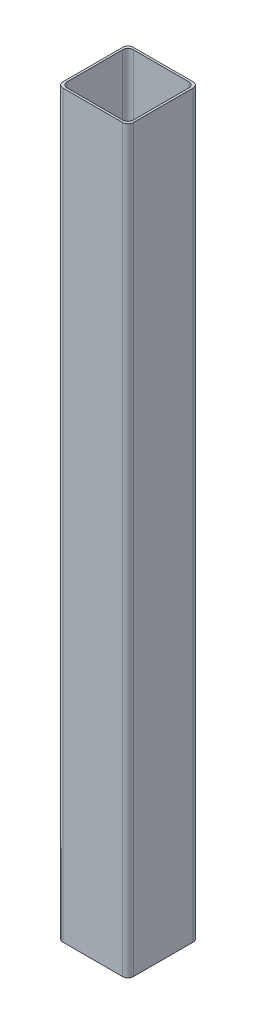
ISO-10303-21;
HEADER;
FILE_DESCRIPTION(('STEP AP214'),'2;1');
FILE_NAME('part.step','',(''),(''),'','','');
FILE_SCHEMA(('AUTOMOTIVE_DESIGN { 1 0 10303 214 1 1 1 1 }'));
ENDSEC;
DATA;
#1=APPLICATION_CONTEXT('core data for automotive mechanical design processes');
#2=APPLICATION_PROTOCOL_DEFINITION('international standard','automotive_design',2000,#1);
#3=PRODUCT_CONTEXT('',#1,'mechanical');
#4=PRODUCT('Part','Part','',(#3));
#5=PRODUCT_RELATED_PRODUCT_CATEGORY('part','',(#4));
#6=PRODUCT_DEFINITION_FORMATION('','',#4);
#7=PRODUCT_DEFINITION_CONTEXT('part definition',#1,'design');
#8=PRODUCT_DEFINITION('design','',#6,#7);
#9=PRODUCT_DEFINITION_SHAPE('','',#8);
#10=(LENGTH_UNIT() NAMED_UNIT(*) SI_UNIT(.MILLI.,.METRE.));
#11=(NAMED_UNIT(*) PLANE_ANGLE_UNIT() SI_UNIT($,.RADIAN.));
#12=(NAMED_UNIT(*) SI_UNIT($,.STERADIAN.) SOLID_ANGLE_UNIT());
#13=UNCERTAINTY_MEASURE_WITH_UNIT(LENGTH_MEASURE(1.E-05),#10,'distance_accuracy_value','');
#14=(GEOMETRIC_REPRESENTATION_CONTEXT(3) GLOBAL_UNCERTAINTY_ASSIGNED_CONTEXT((#13)) GLOBAL_UNIT_ASSIGNED_CONTEXT((#10,
#11,#12)) REPRESENTATION_CONTEXT('',''));
#15=CARTESIAN_POINT('',(0.,0.,0.));
#16=DIRECTION('',(0.,0.,1.));
#17=DIRECTION('',(1.,0.,0.));
#18=AXIS2_PLACEMENT_3D('',#15,#16,#17);
#19=CARTESIAN_POINT('',(0.,210.,0.));
#20=DIRECTION('',(0.,1.,0.));
#21=DIRECTION('',(0.,0.,1.));
#22=AXIS2_PLACEMENT_3D('',#19,#20,#21);
#23=PLANE('',#22);
#24=DIRECTION('',(-1.,0.,0.));
#25=VECTOR('',#24,1.);
#26=CARTESIAN_POINT('',(20.,210.,-20.));
#27=LINE('',#26,#25);
#28=CARTESIAN_POINT('',(17.,210.,-20.));
#29=VERTEX_POINT('',#28);
#30=CARTESIAN_POINT('',(-17.,210.,-20.));
#31=VERTEX_POINT('',#30);
#32=EDGE_CURVE('E183',#29,#31,#27,.T.);
#33=ORIENTED_EDGE('',*,*,#32,.T.);
#34=CARTESIAN_POINT('',(-17.,210.,-17.));
#35=DIRECTION('',(0.,1.,0.));
#36=DIRECTION('',(0.,0.,1.));
#37=AXIS2_PLACEMENT_3D('',#34,#35,#36);
#38=CIRCLE('',#37,3.);
#39=CARTESIAN_POINT('',(-20.,210.,-17.));
#40=VERTEX_POINT('',#39);
#41=EDGE_CURVE('E203',#31,#40,#38,.T.);
#42=ORIENTED_EDGE('',*,*,#41,.T.);
#43=DIRECTION('',(0.,0.,1.));
#44=VECTOR('',#43,1.);
#45=CARTESIAN_POINT('',(-20.,210.,20.));
#46=LINE('',#45,#44);
#47=CARTESIAN_POINT('',(-20.,210.,17.));
#48=VERTEX_POINT('',#47);
#49=EDGE_CURVE('E165',#40,#48,#46,.T.);
#50=ORIENTED_EDGE('',*,*,#49,.T.);
#51=CARTESIAN_POINT('',(-17.,210.,17.));
#52=DIRECTION('',(0.,1.,0.));
#53=DIRECTION('',(0.,0.,1.));
#54=AXIS2_PLACEMENT_3D('',#51,#52,#53);
#55=CIRCLE('',#54,3.);
#56=CARTESIAN_POINT('',(-17.,210.,20.));
#57=VERTEX_POINT('',#56);
#58=EDGE_CURVE('E199',#48,#57,#55,.T.);
#59=ORIENTED_EDGE('',*,*,#58,.T.);
#60=DIRECTION('',(1.,0.,0.));
#61=VECTOR('',#60,1.);
#62=CARTESIAN_POINT('',(20.,210.,20.));
#63=LINE('',#62,#61);
#64=CARTESIAN_POINT('',(17.,210.,20.));
#65=VERTEX_POINT('',#64);
#66=EDGE_CURVE('E275',#57,#65,#63,.T.);
#67=ORIENTED_EDGE('',*,*,#66,.T.);
#68=CARTESIAN_POINT('',(17.,210.,17.));
#69=DIRECTION('',(0.,1.,0.));
#70=DIRECTION('',(0.,0.,1.));
#71=AXIS2_PLACEMENT_3D('',#68,#69,#70);
#72=CIRCLE('',#71,3.);
#73=CARTESIAN_POINT('',(20.,210.,17.));
#74=VERTEX_POINT('',#73);
#75=EDGE_CURVE('E197',#65,#74,#72,.T.);
#76=ORIENTED_EDGE('',*,*,#75,.T.);
#77=DIRECTION('',(0.,0.,-1.));
#78=VECTOR('',#77,1.);
#79=CARTESIAN_POINT('',(20.,210.,20.));
#80=LINE('',#79,#78);
#81=CARTESIAN_POINT('',(20.,210.,-17.));
#82=VERTEX_POINT('',#81);
#83=EDGE_CURVE('E277',#74,#82,#80,.T.);
#84=ORIENTED_EDGE('',*,*,#83,.T.);
#85=CARTESIAN_POINT('',(17.,210.,-17.));
#86=DIRECTION('',(0.,1.,0.));
#87=DIRECTION('',(0.,0.,1.));
#88=AXIS2_PLACEMENT_3D('',#85,#86,#87);
#89=CIRCLE('',#88,3.);
#90=EDGE_CURVE('E201',#82,#29,#89,.T.);
#91=ORIENTED_EDGE('',*,*,#90,.T.);
#92=EDGE_LOOP('',(#33,#42,#50,#59,#67,#76,#84,#91));
#93=FACE_BOUND('',#92,.T.);
#94=DIRECTION('',(0.,0.,-1.));
#95=VECTOR('',#94,1.);
#96=CARTESIAN_POINT('',(18.8,210.,18.8));
#97=LINE('',#96,#95);
#98=CARTESIAN_POINT('',(18.8,210.,15.8));
#99=VERTEX_POINT('',#98);
#100=CARTESIAN_POINT('',(18.8,210.,-15.8));
#101=VERTEX_POINT('',#100);
#102=EDGE_CURVE('E261',#99,#101,#97,.T.);
#103=ORIENTED_EDGE('',*,*,#102,.F.);
#104=CARTESIAN_POINT('',(15.8,210.,15.8));
#105=DIRECTION('',(0.,1.,0.));
#106=DIRECTION('',(0.,0.,1.));
#107=AXIS2_PLACEMENT_3D('',#104,#105,#106);
#108=CIRCLE('',#107,3.);
#109=CARTESIAN_POINT('',(15.8,210.,18.8));
#110=VERTEX_POINT('',#109);
#111=EDGE_CURVE('E240',#99,#110,#108,.F.);
#112=ORIENTED_EDGE('',*,*,#111,.T.);
#113=DIRECTION('',(1.,0.,0.));
#114=VECTOR('',#113,1.);
#115=CARTESIAN_POINT('',(18.8,210.,18.8));
#116=LINE('',#115,#114);
#117=CARTESIAN_POINT('',(-15.8,210.,18.8));
#118=VERTEX_POINT('',#117);
#119=EDGE_CURVE('E256',#118,#110,#116,.T.);
#120=ORIENTED_EDGE('',*,*,#119,.F.);
#121=CARTESIAN_POINT('',(-15.8,210.,15.8));
#122=DIRECTION('',(0.,1.,0.));
#123=DIRECTION('',(0.,0.,1.));
#124=AXIS2_PLACEMENT_3D('',#121,#122,#123);
#125=CIRCLE('',#124,3.);
#126=CARTESIAN_POINT('',(-18.8,210.,15.8));
#127=VERTEX_POINT('',#126);
#128=EDGE_CURVE('E244',#118,#127,#125,.F.);
#129=ORIENTED_EDGE('',*,*,#128,.T.);
#130=DIRECTION('',(0.,0.,1.));
#131=VECTOR('',#130,1.);
#132=CARTESIAN_POINT('',(-18.8,210.,18.8));
#133=LINE('',#132,#131);
#134=CARTESIAN_POINT('',(-18.8,210.,-15.8));
#135=VERTEX_POINT('',#134);
#136=EDGE_CURVE('E174',#135,#127,#133,.T.);
#137=ORIENTED_EDGE('',*,*,#136,.F.);
#138=CARTESIAN_POINT('',(-15.8,210.,-15.8));
#139=DIRECTION('',(0.,1.,0.));
#140=DIRECTION('',(0.,0.,1.));
#141=AXIS2_PLACEMENT_3D('',#138,#139,#140);
#142=CIRCLE('',#141,3.);
#143=CARTESIAN_POINT('',(-15.8,210.,-18.8));
#144=VERTEX_POINT('',#143);
#145=EDGE_CURVE('E11',#135,#144,#142,.F.);
#146=ORIENTED_EDGE('',*,*,#145,.T.);
#147=DIRECTION('',(-1.,0.,0.));
#148=VECTOR('',#147,1.);
#149=CARTESIAN_POINT('',(18.8,210.,-18.8));
#150=LINE('',#149,#148);
#151=CARTESIAN_POINT('',(15.8,210.,-18.8));
#152=VERTEX_POINT('',#151);
#153=EDGE_CURVE('E180',#152,#144,#150,.T.);
#154=ORIENTED_EDGE('',*,*,#153,.F.);
#155=CARTESIAN_POINT('',(15.8,210.,-15.8));
#156=DIRECTION('',(0.,1.,0.));
#157=DIRECTION('',(0.,0.,1.));
#158=AXIS2_PLACEMENT_3D('',#155,#156,#157);
#159=CIRCLE('',#158,3.);
#160=EDGE_CURVE('E236',#152,#101,#159,.F.);
#161=ORIENTED_EDGE('',*,*,#160,.T.);
#162=EDGE_LOOP('',(#103,#112,#120,#129,#137,#146,#154,#161));
#163=FACE_BOUND('',#162,.T.);
#164=ADVANCED_FACE('F32',(#93,#163),#23,.T.);
#165=CARTESIAN_POINT('',(0.,-210.,0.));
#166=DIRECTION('',(0.,1.,0.));
#167=DIRECTION('',(0.,0.,1.));
#168=AXIS2_PLACEMENT_3D('',#165,#166,#167);
#169=PLANE('',#168);
#170=DIRECTION('',(0.,0.,1.));
#171=VECTOR('',#170,1.);
#172=CARTESIAN_POINT('',(-20.,-210.,20.));
#173=LINE('',#172,#171);
#174=CARTESIAN_POINT('',(-20.,-210.,-17.));
#175=VERTEX_POINT('',#174);
#176=CARTESIAN_POINT('',(-20.,-210.,17.));
#177=VERTEX_POINT('',#176);
#178=EDGE_CURVE('E162',#175,#177,#173,.T.);
#179=ORIENTED_EDGE('',*,*,#178,.F.);
#180=CARTESIAN_POINT('',(-17.,-210.,-17.));
#181=DIRECTION('',(0.,1.,0.));
#182=DIRECTION('',(0.,0.,1.));
#183=AXIS2_PLACEMENT_3D('',#180,#181,#182);
#184=CIRCLE('',#183,3.);
#185=CARTESIAN_POINT('',(-17.,-210.,-20.));
#186=VERTEX_POINT('',#185);
#187=EDGE_CURVE('E145',#175,#186,#184,.F.);
#188=ORIENTED_EDGE('',*,*,#187,.T.);
#189=DIRECTION('',(-1.,0.,0.));
#190=VECTOR('',#189,1.);
#191=CARTESIAN_POINT('',(20.,-210.,-20.));
#192=LINE('',#191,#190);
#193=CARTESIAN_POINT('',(17.,-210.,-20.));
#194=VERTEX_POINT('',#193);
#195=EDGE_CURVE('E188',#194,#186,#192,.T.);
#196=ORIENTED_EDGE('',*,*,#195,.F.);
#197=CARTESIAN_POINT('',(17.,-210.,-17.));
#198=DIRECTION('',(0.,1.,0.));
#199=DIRECTION('',(0.,0.,1.));
#200=AXIS2_PLACEMENT_3D('',#197,#198,#199);
#201=CIRCLE('',#200,3.);
#202=CARTESIAN_POINT('',(20.,-210.,-17.));
#203=VERTEX_POINT('',#202);
#204=EDGE_CURVE('E156',#194,#203,#201,.F.);
#205=ORIENTED_EDGE('',*,*,#204,.T.);
#206=DIRECTION('',(0.,0.,-1.));
#207=VECTOR('',#206,1.);
#208=CARTESIAN_POINT('',(20.,-210.,20.));
#209=LINE('',#208,#207);
#210=CARTESIAN_POINT('',(20.,-210.,17.));
#211=VERTEX_POINT('',#210);
#212=EDGE_CURVE('E177',#211,#203,#209,.T.);
#213=ORIENTED_EDGE('',*,*,#212,.F.);
#214=CARTESIAN_POINT('',(17.,-210.,17.));
#215=DIRECTION('',(0.,1.,0.));
#216=DIRECTION('',(0.,0.,1.));
#217=AXIS2_PLACEMENT_3D('',#214,#215,#216);
#218=CIRCLE('',#217,3.);
#219=CARTESIAN_POINT('',(17.,-210.,20.));
#220=VERTEX_POINT('',#219);
#221=EDGE_CURVE('E166',#211,#220,#218,.F.);
#222=ORIENTED_EDGE('',*,*,#221,.T.);
#223=DIRECTION('',(1.,0.,0.));
#224=VECTOR('',#223,1.);
#225=CARTESIAN_POINT('',(20.,-210.,20.));
#226=LINE('',#225,#224);
#227=CARTESIAN_POINT('',(-17.,-210.,20.));
#228=VERTEX_POINT('',#227);
#229=EDGE_CURVE('E173',#228,#220,#226,.T.);
#230=ORIENTED_EDGE('',*,*,#229,.F.);
#231=CARTESIAN_POINT('',(-17.,-210.,17.));
#232=DIRECTION('',(0.,1.,0.));
#233=DIRECTION('',(0.,0.,1.));
#234=AXIS2_PLACEMENT_3D('',#231,#232,#233);
#235=CIRCLE('',#234,3.);
#236=EDGE_CURVE('E172',#228,#177,#235,.F.);
#237=ORIENTED_EDGE('',*,*,#236,.T.);
#238=EDGE_LOOP('',(#179,#188,#196,#205,#213,#222,#230,#237));
#239=FACE_BOUND('',#238,.T.);
#240=DIRECTION('',(0.,0.,1.));
#241=VECTOR('',#240,1.);
#242=CARTESIAN_POINT('',(-18.8,-210.,18.8));
#243=LINE('',#242,#241);
#244=CARTESIAN_POINT('',(-18.8,-210.,-15.8));
#245=VERTEX_POINT('',#244);
#246=CARTESIAN_POINT('',(-18.8,-210.,15.8));
#247=VERTEX_POINT('',#246);
#248=EDGE_CURVE('E248',#245,#247,#243,.T.);
#249=ORIENTED_EDGE('',*,*,#248,.T.);
#250=CARTESIAN_POINT('',(-15.8,-210.,15.8));
#251=DIRECTION('',(0.,1.,0.));
#252=DIRECTION('',(0.,0.,1.));
#253=AXIS2_PLACEMENT_3D('',#250,#251,#252);
#254=CIRCLE('',#253,3.);
#255=CARTESIAN_POINT('',(-15.8,-210.,18.8));
#256=VERTEX_POINT('',#255);
#257=EDGE_CURVE('E242',#247,#256,#254,.T.);
#258=ORIENTED_EDGE('',*,*,#257,.T.);
#259=DIRECTION('',(1.,0.,0.));
#260=VECTOR('',#259,1.);
#261=CARTESIAN_POINT('',(18.8,-210.,18.8));
#262=LINE('',#261,#260);
#263=CARTESIAN_POINT('',(15.8,-210.,18.8));
#264=VERTEX_POINT('',#263);
#265=EDGE_CURVE('E267',#256,#264,#262,.T.);
#266=ORIENTED_EDGE('',*,*,#265,.T.);
#267=CARTESIAN_POINT('',(15.8,-210.,15.8));
#268=DIRECTION('',(0.,1.,0.));
#269=DIRECTION('',(0.,0.,1.));
#270=AXIS2_PLACEMENT_3D('',#267,#268,#269);
#271=CIRCLE('',#270,3.);
#272=CARTESIAN_POINT('',(18.8,-210.,15.8));
#273=VERTEX_POINT('',#272);
#274=EDGE_CURVE('E238',#264,#273,#271,.T.);
#275=ORIENTED_EDGE('',*,*,#274,.T.);
#276=DIRECTION('',(0.,0.,-1.));
#277=VECTOR('',#276,1.);
#278=CARTESIAN_POINT('',(18.8,-210.,18.8));
#279=LINE('',#278,#277);
#280=CARTESIAN_POINT('',(18.8,-210.,-15.8));
#281=VERTEX_POINT('',#280);
#282=EDGE_CURVE('E270',#273,#281,#279,.T.);
#283=ORIENTED_EDGE('',*,*,#282,.T.);
#284=CARTESIAN_POINT('',(15.8,-210.,-15.8));
#285=DIRECTION('',(0.,1.,0.));
#286=DIRECTION('',(0.,0.,1.));
#287=AXIS2_PLACEMENT_3D('',#284,#285,#286);
#288=CIRCLE('',#287,3.);
#289=CARTESIAN_POINT('',(15.8,-210.,-18.8));
#290=VERTEX_POINT('',#289);
#291=EDGE_CURVE('E234',#281,#290,#288,.T.);
#292=ORIENTED_EDGE('',*,*,#291,.T.);
#293=DIRECTION('',(-1.,0.,0.));
#294=VECTOR('',#293,1.);
#295=CARTESIAN_POINT('',(18.8,-210.,-18.8));
#296=LINE('',#295,#294);
#297=CARTESIAN_POINT('',(-15.8,-210.,-18.8));
#298=VERTEX_POINT('',#297);
#299=EDGE_CURVE('E249',#290,#298,#296,.T.);
#300=ORIENTED_EDGE('',*,*,#299,.T.);
#301=CARTESIAN_POINT('',(-15.8,-210.,-15.8));
#302=DIRECTION('',(0.,1.,0.));
#303=DIRECTION('',(0.,0.,1.));
#304=AXIS2_PLACEMENT_3D('',#301,#302,#303);
#305=CIRCLE('',#304,3.);
#306=EDGE_CURVE('E40',#298,#245,#305,.T.);
#307=ORIENTED_EDGE('',*,*,#306,.T.);
#308=EDGE_LOOP('',(#249,#258,#266,#275,#283,#292,#300,#307));
#309=FACE_BOUND('',#308,.T.);
#310=ADVANCED_FACE('F169',(#239,#309),#169,.F.);
#311=CARTESIAN_POINT('',(-20.,210.,20.));
#312=DIRECTION('',(1.,0.,0.));
#313=DIRECTION('',(0.,0.,-1.));
#314=AXIS2_PLACEMENT_3D('',#311,#312,#313);
#315=PLANE('',#314);
#316=ORIENTED_EDGE('',*,*,#49,.F.);
#317=DIRECTION('',(0.,-1.,0.));
#318=VECTOR('',#317,1.);
#319=CARTESIAN_POINT('',(-20.,210.,-17.));
#320=LINE('',#319,#318);
#321=EDGE_CURVE('E149',#40,#175,#320,.T.);
#322=ORIENTED_EDGE('',*,*,#321,.T.);
#323=ORIENTED_EDGE('',*,*,#178,.T.);
#324=DIRECTION('',(0.,-1.,0.));
#325=VECTOR('',#324,1.);
#326=CARTESIAN_POINT('',(-20.,210.,17.));
#327=LINE('',#326,#325);
#328=EDGE_CURVE('E167',#177,#48,#327,.F.);
#329=ORIENTED_EDGE('',*,*,#328,.T.);
#330=EDGE_LOOP('',(#316,#322,#323,#329));
#331=FACE_BOUND('',#330,.T.);
#332=ADVANCED_FACE('F161',(#331),#315,.F.);
#333=CARTESIAN_POINT('',(20.,210.,20.));
#334=DIRECTION('',(0.,0.,-1.));
#335=DIRECTION('',(-1.,0.,0.));
#336=AXIS2_PLACEMENT_3D('',#333,#334,#335);
#337=PLANE('',#336);
#338=ORIENTED_EDGE('',*,*,#66,.F.);
#339=DIRECTION('',(0.,-1.,0.));
#340=VECTOR('',#339,1.);
#341=CARTESIAN_POINT('',(-17.,210.,20.));
#342=LINE('',#341,#340);
#343=EDGE_CURVE('E231',#57,#228,#342,.T.);
#344=ORIENTED_EDGE('',*,*,#343,.T.);
#345=ORIENTED_EDGE('',*,*,#229,.T.);
#346=DIRECTION('',(0.,-1.,0.));
#347=VECTOR('',#346,1.);
#348=CARTESIAN_POINT('',(17.,210.,20.));
#349=LINE('',#348,#347);
#350=EDGE_CURVE('E229',#220,#65,#349,.F.);
#351=ORIENTED_EDGE('',*,*,#350,.T.);
#352=EDGE_LOOP('',(#338,#344,#345,#351));
#353=FACE_BOUND('',#352,.T.);
#354=ADVANCED_FACE('F299',(#353),#337,.F.);
#355=CARTESIAN_POINT('',(20.,210.,20.));
#356=DIRECTION('',(-1.,0.,0.));
#357=DIRECTION('',(0.,0.,1.));
#358=AXIS2_PLACEMENT_3D('',#355,#356,#357);
#359=PLANE('',#358);
#360=ORIENTED_EDGE('',*,*,#212,.T.);
#361=DIRECTION('',(0.,-1.,0.));
#362=VECTOR('',#361,1.);
#363=CARTESIAN_POINT('',(20.,210.,-17.));
#364=LINE('',#363,#362);
#365=EDGE_CURVE('E208',#203,#82,#364,.F.);
#366=ORIENTED_EDGE('',*,*,#365,.T.);
#367=ORIENTED_EDGE('',*,*,#83,.F.);
#368=DIRECTION('',(0.,-1.,0.));
#369=VECTOR('',#368,1.);
#370=CARTESIAN_POINT('',(20.,210.,17.));
#371=LINE('',#370,#369);
#372=EDGE_CURVE('E205',#74,#211,#371,.T.);
#373=ORIENTED_EDGE('',*,*,#372,.T.);
#374=EDGE_LOOP('',(#360,#366,#367,#373));
#375=FACE_BOUND('',#374,.T.);
#376=ADVANCED_FACE('F292',(#375),#359,.F.);
#377=CARTESIAN_POINT('',(20.,210.,-20.));
#378=DIRECTION('',(0.,0.,1.));
#379=DIRECTION('',(1.,0.,0.));
#380=AXIS2_PLACEMENT_3D('',#377,#378,#379);
#381=PLANE('',#380);
#382=ORIENTED_EDGE('',*,*,#195,.T.);
#383=DIRECTION('',(0.,-1.,0.));
#384=VECTOR('',#383,1.);
#385=CARTESIAN_POINT('',(-17.,210.,-20.));
#386=LINE('',#385,#384);
#387=EDGE_CURVE('E150',#186,#31,#386,.F.);
#388=ORIENTED_EDGE('',*,*,#387,.T.);
#389=ORIENTED_EDGE('',*,*,#32,.F.);
#390=DIRECTION('',(0.,-1.,0.));
#391=VECTOR('',#390,1.);
#392=CARTESIAN_POINT('',(17.,210.,-20.));
#393=LINE('',#392,#391);
#394=EDGE_CURVE('E155',#29,#194,#393,.T.);
#395=ORIENTED_EDGE('',*,*,#394,.T.);
#396=EDGE_LOOP('',(#382,#388,#389,#395));
#397=FACE_BOUND('',#396,.T.);
#398=ADVANCED_FACE('F286',(#397),#381,.F.);
#399=CARTESIAN_POINT('',(18.8,210.,18.8));
#400=DIRECTION('',(0.,0.,-1.));
#401=DIRECTION('',(-1.,0.,0.));
#402=AXIS2_PLACEMENT_3D('',#399,#400,#401);
#403=PLANE('',#402);
#404=ORIENTED_EDGE('',*,*,#119,.T.);
#405=DIRECTION('',(0.,-1.,0.));
#406=VECTOR('',#405,1.);
#407=CARTESIAN_POINT('',(15.8,-210.,18.8));
#408=LINE('',#407,#406);
#409=EDGE_CURVE('E221',#110,#264,#408,.T.);
#410=ORIENTED_EDGE('',*,*,#409,.T.);
#411=ORIENTED_EDGE('',*,*,#265,.F.);
#412=DIRECTION('',(0.,-1.,0.));
#413=VECTOR('',#412,1.);
#414=CARTESIAN_POINT('',(-15.8,210.,18.8));
#415=LINE('',#414,#413);
#416=EDGE_CURVE('E219',#256,#118,#415,.F.);
#417=ORIENTED_EDGE('',*,*,#416,.T.);
#418=EDGE_LOOP('',(#404,#410,#411,#417));
#419=FACE_BOUND('',#418,.T.);
#420=ADVANCED_FACE('F318',(#419),#403,.T.);
#421=CARTESIAN_POINT('',(18.8,210.,18.8));
#422=DIRECTION('',(-1.,0.,0.));
#423=DIRECTION('',(0.,0.,1.));
#424=AXIS2_PLACEMENT_3D('',#421,#422,#423);
#425=PLANE('',#424);
#426=ORIENTED_EDGE('',*,*,#102,.T.);
#427=DIRECTION('',(0.,-1.,0.));
#428=VECTOR('',#427,1.);
#429=CARTESIAN_POINT('',(18.8,-210.,-15.8));
#430=LINE('',#429,#428);
#431=EDGE_CURVE('E212',#101,#281,#430,.T.);
#432=ORIENTED_EDGE('',*,*,#431,.T.);
#433=ORIENTED_EDGE('',*,*,#282,.F.);
#434=DIRECTION('',(0.,-1.,0.));
#435=VECTOR('',#434,1.);
#436=CARTESIAN_POINT('',(18.8,210.,15.8));
#437=LINE('',#436,#435);
#438=EDGE_CURVE('E210',#273,#99,#437,.F.);
#439=ORIENTED_EDGE('',*,*,#438,.T.);
#440=EDGE_LOOP('',(#426,#432,#433,#439));
#441=FACE_BOUND('',#440,.T.);
#442=ADVANCED_FACE('F357',(#441),#425,.T.);
#443=CARTESIAN_POINT('',(18.8,210.,-18.8));
#444=DIRECTION('',(0.,0.,1.));
#445=DIRECTION('',(1.,0.,0.));
#446=AXIS2_PLACEMENT_3D('',#443,#444,#445);
#447=PLANE('',#446);
#448=ORIENTED_EDGE('',*,*,#299,.F.);
#449=DIRECTION('',(0.,-1.,0.));
#450=VECTOR('',#449,1.);
#451=CARTESIAN_POINT('',(15.8,210.,-18.8));
#452=LINE('',#451,#450);
#453=EDGE_CURVE('E52',#290,#152,#452,.F.);
#454=ORIENTED_EDGE('',*,*,#453,.T.);
#455=ORIENTED_EDGE('',*,*,#153,.T.);
#456=DIRECTION('',(0.,-1.,0.));
#457=VECTOR('',#456,1.);
#458=CARTESIAN_POINT('',(-15.8,-210.,-18.8));
#459=LINE('',#458,#457);
#460=EDGE_CURVE('E215',#144,#298,#459,.T.);
#461=ORIENTED_EDGE('',*,*,#460,.T.);
#462=EDGE_LOOP('',(#448,#454,#455,#461));
#463=FACE_BOUND('',#462,.T.);
#464=ADVANCED_FACE('F259',(#463),#447,.T.);
#465=CARTESIAN_POINT('',(-18.8,210.,18.8));
#466=DIRECTION('',(1.,0.,0.));
#467=DIRECTION('',(0.,0.,-1.));
#468=AXIS2_PLACEMENT_3D('',#465,#466,#467);
#469=PLANE('',#468);
#470=ORIENTED_EDGE('',*,*,#136,.T.);
#471=DIRECTION('',(0.,-1.,0.));
#472=VECTOR('',#471,1.);
#473=CARTESIAN_POINT('',(-18.8,-210.,15.8));
#474=LINE('',#473,#472);
#475=EDGE_CURVE('E226',#127,#247,#474,.T.);
#476=ORIENTED_EDGE('',*,*,#475,.T.);
#477=ORIENTED_EDGE('',*,*,#248,.F.);
#478=DIRECTION('',(0.,-1.,0.));
#479=VECTOR('',#478,1.);
#480=CARTESIAN_POINT('',(-18.8,210.,-15.8));
#481=LINE('',#480,#479);
#482=EDGE_CURVE('E224',#245,#135,#481,.F.);
#483=ORIENTED_EDGE('',*,*,#482,.T.);
#484=EDGE_LOOP('',(#470,#476,#477,#483));
#485=FACE_BOUND('',#484,.T.);
#486=ADVANCED_FACE('F254',(#485),#469,.T.);
#487=CARTESIAN_POINT('',(-17.,210.,-17.));
#488=DIRECTION('',(0.,-1.,0.));
#489=DIRECTION('',(0.,0.,-1.));
#490=AXIS2_PLACEMENT_3D('',#487,#488,#489);
#491=CYLINDRICAL_SURFACE('',#490,3.);
#492=ORIENTED_EDGE('',*,*,#41,.F.);
#493=ORIENTED_EDGE('',*,*,#387,.F.);
#494=ORIENTED_EDGE('',*,*,#187,.F.);
#495=ORIENTED_EDGE('',*,*,#321,.F.);
#496=EDGE_LOOP('',(#492,#493,#494,#495));
#497=FACE_BOUND('',#496,.T.);
#498=ADVANCED_FACE('F148',(#497),#491,.T.);
#499=CARTESIAN_POINT('',(17.,210.,-17.));
#500=DIRECTION('',(0.,-1.,0.));
#501=DIRECTION('',(0.,0.,-1.));
#502=AXIS2_PLACEMENT_3D('',#499,#500,#501);
#503=CYLINDRICAL_SURFACE('',#502,3.);
#504=ORIENTED_EDGE('',*,*,#90,.F.);
#505=ORIENTED_EDGE('',*,*,#365,.F.);
#506=ORIENTED_EDGE('',*,*,#204,.F.);
#507=ORIENTED_EDGE('',*,*,#394,.F.);
#508=EDGE_LOOP('',(#504,#505,#506,#507));
#509=FACE_BOUND('',#508,.T.);
#510=ADVANCED_FACE('F288',(#509),#503,.T.);
#511=CARTESIAN_POINT('',(15.8,210.,-15.8));
#512=DIRECTION('',(0.,1.,0.));
#513=DIRECTION('',(0.,0.,1.));
#514=AXIS2_PLACEMENT_3D('',#511,#512,#513);
#515=CYLINDRICAL_SURFACE('',#514,3.);
#516=ORIENTED_EDGE('',*,*,#160,.F.);
#517=ORIENTED_EDGE('',*,*,#453,.F.);
#518=ORIENTED_EDGE('',*,*,#291,.F.);
#519=ORIENTED_EDGE('',*,*,#431,.F.);
#520=EDGE_LOOP('',(#516,#517,#518,#519));
#521=FACE_BOUND('',#520,.T.);
#522=ADVANCED_FACE('F333',(#521),#515,.F.);
#523=CARTESIAN_POINT('',(15.8,210.,15.8));
#524=DIRECTION('',(0.,1.,0.));
#525=DIRECTION('',(0.,0.,1.));
#526=AXIS2_PLACEMENT_3D('',#523,#524,#525);
#527=CYLINDRICAL_SURFACE('',#526,3.);
#528=ORIENTED_EDGE('',*,*,#111,.F.);
#529=ORIENTED_EDGE('',*,*,#438,.F.);
#530=ORIENTED_EDGE('',*,*,#274,.F.);
#531=ORIENTED_EDGE('',*,*,#409,.F.);
#532=EDGE_LOOP('',(#528,#529,#530,#531));
#533=FACE_BOUND('',#532,.T.);
#534=ADVANCED_FACE('F336',(#533),#527,.F.);
#535=CARTESIAN_POINT('',(-15.8,210.,15.8));
#536=DIRECTION('',(0.,1.,0.));
#537=DIRECTION('',(0.,0.,1.));
#538=AXIS2_PLACEMENT_3D('',#535,#536,#537);
#539=CYLINDRICAL_SURFACE('',#538,3.);
#540=ORIENTED_EDGE('',*,*,#128,.F.);
#541=ORIENTED_EDGE('',*,*,#416,.F.);
#542=ORIENTED_EDGE('',*,*,#257,.F.);
#543=ORIENTED_EDGE('',*,*,#475,.F.);
#544=EDGE_LOOP('',(#540,#541,#542,#543));
#545=FACE_BOUND('',#544,.T.);
#546=ADVANCED_FACE('F309',(#545),#539,.F.);
#547=CARTESIAN_POINT('',(-15.8,210.,-15.8));
#548=DIRECTION('',(0.,1.,0.));
#549=DIRECTION('',(0.,0.,1.));
#550=AXIS2_PLACEMENT_3D('',#547,#548,#549);
#551=CYLINDRICAL_SURFACE('',#550,3.);
#552=ORIENTED_EDGE('',*,*,#145,.F.);
#553=ORIENTED_EDGE('',*,*,#482,.F.);
#554=ORIENTED_EDGE('',*,*,#306,.F.);
#555=ORIENTED_EDGE('',*,*,#460,.F.);
#556=EDGE_LOOP('',(#552,#553,#554,#555));
#557=FACE_BOUND('',#556,.T.);
#558=ADVANCED_FACE('F258',(#557),#551,.F.);
#559=CARTESIAN_POINT('',(-17.,210.,17.));
#560=DIRECTION('',(0.,-1.,0.));
#561=DIRECTION('',(0.,0.,-1.));
#562=AXIS2_PLACEMENT_3D('',#559,#560,#561);
#563=CYLINDRICAL_SURFACE('',#562,3.);
#564=ORIENTED_EDGE('',*,*,#58,.F.);
#565=ORIENTED_EDGE('',*,*,#328,.F.);
#566=ORIENTED_EDGE('',*,*,#236,.F.);
#567=ORIENTED_EDGE('',*,*,#343,.F.);
#568=EDGE_LOOP('',(#564,#565,#566,#567));
#569=FACE_BOUND('',#568,.T.);
#570=ADVANCED_FACE('F303',(#569),#563,.T.);
#571=CARTESIAN_POINT('',(17.,210.,17.));
#572=DIRECTION('',(0.,-1.,0.));
#573=DIRECTION('',(0.,0.,-1.));
#574=AXIS2_PLACEMENT_3D('',#571,#572,#573);
#575=CYLINDRICAL_SURFACE('',#574,3.);
#576=ORIENTED_EDGE('',*,*,#75,.F.);
#577=ORIENTED_EDGE('',*,*,#350,.F.);
#578=ORIENTED_EDGE('',*,*,#221,.F.);
#579=ORIENTED_EDGE('',*,*,#372,.F.);
#580=EDGE_LOOP('',(#576,#577,#578,#579));
#581=FACE_BOUND('',#580,.T.);
#582=ADVANCED_FACE('F34',(#581),#575,.T.);
#583=CLOSED_SHELL('',(#164,#310,#332,#354,#376,#398,#420,#442,#464,#486,#498,#510,#522,#534,
#546,#558,#570,#582));
#584=MANIFOLD_SOLID_BREP('B2',#583);
#585=ADVANCED_BREP_SHAPE_REPRESENTATION('',(#18,#584),#14);
#586=SHAPE_DEFINITION_REPRESENTATION(#9,#585);
ENDSEC;
END-ISO-10303-21;
